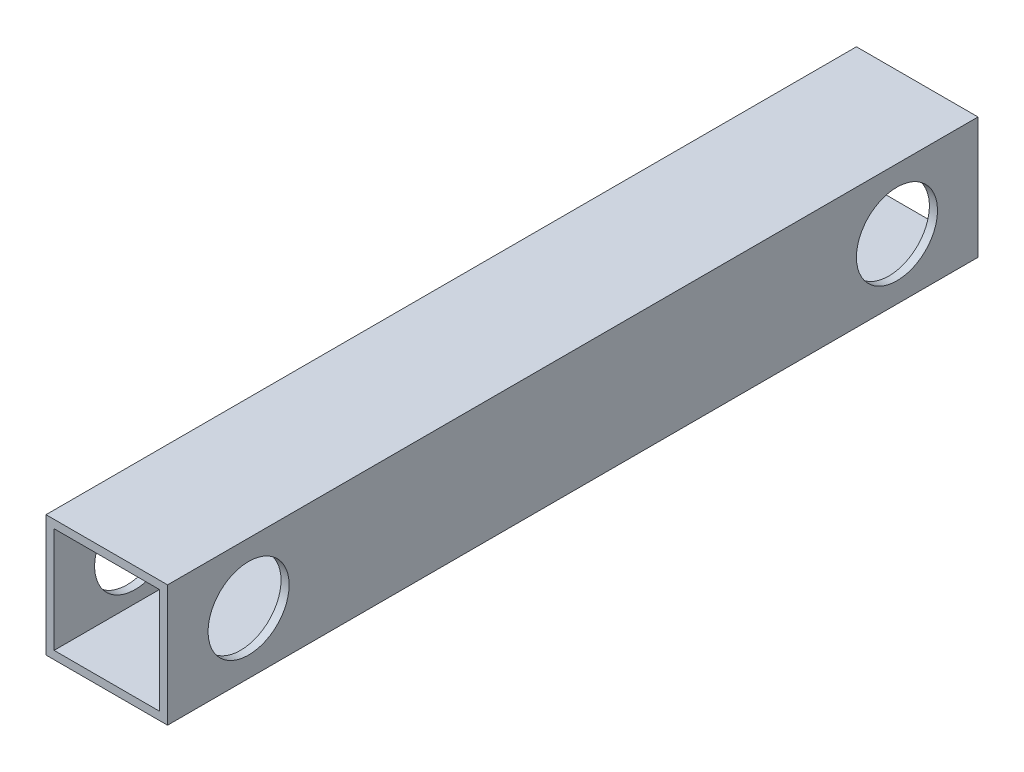
ISO-10303-21;
HEADER;
FILE_DESCRIPTION(('STEP AP214'),'2;1');
FILE_NAME('part.step','',(''),(''),'','','');
FILE_SCHEMA(('AUTOMOTIVE_DESIGN { 1 0 10303 214 1 1 1 1 }'));
ENDSEC;
DATA;
#1=APPLICATION_CONTEXT('core data for automotive mechanical design processes');
#2=APPLICATION_PROTOCOL_DEFINITION('international standard','automotive_design',2000,#1);
#3=PRODUCT_CONTEXT('',#1,'mechanical');
#4=PRODUCT('Part','Part','',(#3));
#5=PRODUCT_RELATED_PRODUCT_CATEGORY('part','',(#4));
#6=PRODUCT_DEFINITION_FORMATION('','',#4);
#7=PRODUCT_DEFINITION_CONTEXT('part definition',#1,'design');
#8=PRODUCT_DEFINITION('design','',#6,#7);
#9=PRODUCT_DEFINITION_SHAPE('','',#8);
#10=(LENGTH_UNIT() NAMED_UNIT(*) SI_UNIT(.MILLI.,.METRE.));
#11=(NAMED_UNIT(*) PLANE_ANGLE_UNIT() SI_UNIT($,.RADIAN.));
#12=(NAMED_UNIT(*) SI_UNIT($,.STERADIAN.) SOLID_ANGLE_UNIT());
#13=UNCERTAINTY_MEASURE_WITH_UNIT(LENGTH_MEASURE(1.E-05),#10,'distance_accuracy_value','');
#14=(GEOMETRIC_REPRESENTATION_CONTEXT(3) GLOBAL_UNCERTAINTY_ASSIGNED_CONTEXT((#13)) GLOBAL_UNIT_ASSIGNED_CONTEXT((#10,
#11,#12)) REPRESENTATION_CONTEXT('',''));
#15=CARTESIAN_POINT('',(0.,0.,0.));
#16=DIRECTION('',(0.,0.,1.));
#17=DIRECTION('',(1.,0.,0.));
#18=AXIS2_PLACEMENT_3D('',#15,#16,#17);
#19=CARTESIAN_POINT('',(0.,0.,200.));
#20=DIRECTION('',(0.,0.,-1.));
#21=DIRECTION('',(-1.,0.,0.));
#22=AXIS2_PLACEMENT_3D('',#19,#20,#21);
#23=PLANE('',#22);
#24=DIRECTION('',(0.,1.,0.));
#25=VECTOR('',#24,1.);
#26=CARTESIAN_POINT('',(15.,-15.,200.));
#27=LINE('',#26,#25);
#28=CARTESIAN_POINT('',(15.,-15.,200.));
#29=VERTEX_POINT('',#28);
#30=CARTESIAN_POINT('',(15.,15.,200.));
#31=VERTEX_POINT('',#30);
#32=EDGE_CURVE('E157',#29,#31,#27,.T.);
#33=ORIENTED_EDGE('',*,*,#32,.T.);
#34=DIRECTION('',(-1.,0.,0.));
#35=VECTOR('',#34,1.);
#36=CARTESIAN_POINT('',(-15.,15.,200.));
#37=LINE('',#36,#35);
#38=CARTESIAN_POINT('',(-15.,15.,200.));
#39=VERTEX_POINT('',#38);
#40=EDGE_CURVE('E161',#31,#39,#37,.T.);
#41=ORIENTED_EDGE('',*,*,#40,.T.);
#42=DIRECTION('',(0.,-1.,0.));
#43=VECTOR('',#42,1.);
#44=CARTESIAN_POINT('',(-15.,-15.,200.));
#45=LINE('',#44,#43);
#46=CARTESIAN_POINT('',(-15.,-15.,200.));
#47=VERTEX_POINT('',#46);
#48=EDGE_CURVE('E165',#39,#47,#45,.T.);
#49=ORIENTED_EDGE('',*,*,#48,.T.);
#50=DIRECTION('',(1.,0.,0.));
#51=VECTOR('',#50,1.);
#52=CARTESIAN_POINT('',(-15.,-15.,200.));
#53=LINE('',#52,#51);
#54=EDGE_CURVE('E168',#47,#29,#53,.T.);
#55=ORIENTED_EDGE('',*,*,#54,.T.);
#56=EDGE_LOOP('',(#33,#41,#49,#55));
#57=FACE_BOUND('',#56,.T.);
#58=DIRECTION('',(0.,1.,0.));
#59=VECTOR('',#58,1.);
#60=CARTESIAN_POINT('',(13.,-13.,200.));
#61=LINE('',#60,#59);
#62=CARTESIAN_POINT('',(13.,-13.,200.));
#63=VERTEX_POINT('',#62);
#64=CARTESIAN_POINT('',(13.,13.,200.));
#65=VERTEX_POINT('',#64);
#66=EDGE_CURVE('E107',#63,#65,#61,.T.);
#67=ORIENTED_EDGE('',*,*,#66,.F.);
#68=DIRECTION('',(1.,0.,0.));
#69=VECTOR('',#68,1.);
#70=CARTESIAN_POINT('',(-13.,-13.,200.));
#71=LINE('',#70,#69);
#72=CARTESIAN_POINT('',(-13.,-13.,200.));
#73=VERTEX_POINT('',#72);
#74=EDGE_CURVE('E133',#73,#63,#71,.T.);
#75=ORIENTED_EDGE('',*,*,#74,.F.);
#76=DIRECTION('',(0.,-1.,0.));
#77=VECTOR('',#76,1.);
#78=CARTESIAN_POINT('',(-13.,-13.,200.));
#79=LINE('',#78,#77);
#80=CARTESIAN_POINT('',(-13.,13.,200.));
#81=VERTEX_POINT('',#80);
#82=EDGE_CURVE('E129',#81,#73,#79,.T.);
#83=ORIENTED_EDGE('',*,*,#82,.F.);
#84=DIRECTION('',(-1.,0.,0.));
#85=VECTOR('',#84,1.);
#86=CARTESIAN_POINT('',(-13.,13.,200.));
#87=LINE('',#86,#85);
#88=EDGE_CURVE('E116',#65,#81,#87,.T.);
#89=ORIENTED_EDGE('',*,*,#88,.F.);
#90=EDGE_LOOP('',(#67,#75,#83,#89));
#91=FACE_BOUND('',#90,.T.);
#92=ADVANCED_FACE('F39',(#57,#91),#23,.F.);
#93=CARTESIAN_POINT('',(0.,0.,0.));
#94=DIRECTION('',(0.,0.,-1.));
#95=DIRECTION('',(-1.,0.,0.));
#96=AXIS2_PLACEMENT_3D('',#93,#94,#95);
#97=PLANE('',#96);
#98=DIRECTION('',(0.,1.,0.));
#99=VECTOR('',#98,1.);
#100=CARTESIAN_POINT('',(15.,-15.,0.));
#101=LINE('',#100,#99);
#102=CARTESIAN_POINT('',(15.,-15.,0.));
#103=VERTEX_POINT('',#102);
#104=CARTESIAN_POINT('',(15.,15.,0.));
#105=VERTEX_POINT('',#104);
#106=EDGE_CURVE('E125',#103,#105,#101,.T.);
#107=ORIENTED_EDGE('',*,*,#106,.F.);
#108=DIRECTION('',(1.,0.,0.));
#109=VECTOR('',#108,1.);
#110=CARTESIAN_POINT('',(-15.,-15.,0.));
#111=LINE('',#110,#109);
#112=CARTESIAN_POINT('',(-15.,-15.,0.));
#113=VERTEX_POINT('',#112);
#114=EDGE_CURVE('E162',#113,#103,#111,.T.);
#115=ORIENTED_EDGE('',*,*,#114,.F.);
#116=DIRECTION('',(0.,-1.,0.));
#117=VECTOR('',#116,1.);
#118=CARTESIAN_POINT('',(-15.,-15.,0.));
#119=LINE('',#118,#117);
#120=CARTESIAN_POINT('',(-15.,15.,0.));
#121=VERTEX_POINT('',#120);
#122=EDGE_CURVE('E178',#121,#113,#119,.T.);
#123=ORIENTED_EDGE('',*,*,#122,.F.);
#124=DIRECTION('',(-1.,0.,0.));
#125=VECTOR('',#124,1.);
#126=CARTESIAN_POINT('',(-15.,15.,0.));
#127=LINE('',#126,#125);
#128=EDGE_CURVE('E175',#105,#121,#127,.T.);
#129=ORIENTED_EDGE('',*,*,#128,.F.);
#130=EDGE_LOOP('',(#107,#115,#123,#129));
#131=FACE_BOUND('',#130,.T.);
#132=DIRECTION('',(1.,0.,0.));
#133=VECTOR('',#132,1.);
#134=CARTESIAN_POINT('',(-13.,-13.,0.));
#135=LINE('',#134,#133);
#136=CARTESIAN_POINT('',(-13.,-13.,0.));
#137=VERTEX_POINT('',#136);
#138=CARTESIAN_POINT('',(13.,-13.,0.));
#139=VERTEX_POINT('',#138);
#140=EDGE_CURVE('E117',#137,#139,#135,.T.);
#141=ORIENTED_EDGE('',*,*,#140,.T.);
#142=DIRECTION('',(0.,1.,0.));
#143=VECTOR('',#142,1.);
#144=CARTESIAN_POINT('',(13.,-13.,0.));
#145=LINE('',#144,#143);
#146=CARTESIAN_POINT('',(13.,13.,0.));
#147=VERTEX_POINT('',#146);
#148=EDGE_CURVE('E65',#139,#147,#145,.T.);
#149=ORIENTED_EDGE('',*,*,#148,.T.);
#150=DIRECTION('',(-1.,0.,0.));
#151=VECTOR('',#150,1.);
#152=CARTESIAN_POINT('',(-13.,13.,0.));
#153=LINE('',#152,#151);
#154=CARTESIAN_POINT('',(-13.,13.,0.));
#155=VERTEX_POINT('',#154);
#156=EDGE_CURVE('E123',#147,#155,#153,.T.);
#157=ORIENTED_EDGE('',*,*,#156,.T.);
#158=DIRECTION('',(0.,-1.,0.));
#159=VECTOR('',#158,1.);
#160=CARTESIAN_POINT('',(-13.,-13.,0.));
#161=LINE('',#160,#159);
#162=EDGE_CURVE('E144',#155,#137,#161,.T.);
#163=ORIENTED_EDGE('',*,*,#162,.T.);
#164=EDGE_LOOP('',(#141,#149,#157,#163));
#165=FACE_BOUND('',#164,.T.);
#166=ADVANCED_FACE('F244',(#131,#165),#97,.T.);
#167=CARTESIAN_POINT('',(15.,-15.,200.));
#168=DIRECTION('',(-1.,0.,0.));
#169=DIRECTION('',(0.,0.,1.));
#170=AXIS2_PLACEMENT_3D('',#167,#168,#169);
#171=PLANE('',#170);
#172=CARTESIAN_POINT('',(15.,0.,180.));
#173=DIRECTION('',(1.,0.,0.));
#174=DIRECTION('',(0.,0.,-1.));
#175=AXIS2_PLACEMENT_3D('',#172,#173,#174);
#176=CIRCLE('',#175,10.);
#177=CARTESIAN_POINT('',(15.,0.,170.));
#178=VERTEX_POINT('',#177);
#179=EDGE_CURVE('E196',#178,#178,#176,.T.);
#180=ORIENTED_EDGE('',*,*,#179,.F.);
#181=EDGE_LOOP('',(#180));
#182=FACE_BOUND('',#181,.T.);
#183=CARTESIAN_POINT('',(15.,0.,20.));
#184=DIRECTION('',(1.,0.,0.));
#185=DIRECTION('',(0.,0.,1.));
#186=AXIS2_PLACEMENT_3D('',#183,#184,#185);
#187=CIRCLE('',#186,10.);
#188=CARTESIAN_POINT('',(15.,0.,30.));
#189=VERTEX_POINT('',#188);
#190=EDGE_CURVE('E205',#189,#189,#187,.T.);
#191=ORIENTED_EDGE('',*,*,#190,.F.);
#192=EDGE_LOOP('',(#191));
#193=FACE_BOUND('',#192,.T.);
#194=ORIENTED_EDGE('',*,*,#106,.T.);
#195=DIRECTION('',(0.,0.,-1.));
#196=VECTOR('',#195,1.);
#197=CARTESIAN_POINT('',(15.,15.,200.));
#198=LINE('',#197,#196);
#199=EDGE_CURVE('E11',#31,#105,#198,.T.);
#200=ORIENTED_EDGE('',*,*,#199,.F.);
#201=ORIENTED_EDGE('',*,*,#32,.F.);
#202=DIRECTION('',(0.,0.,-1.));
#203=VECTOR('',#202,1.);
#204=CARTESIAN_POINT('',(15.,-15.,200.));
#205=LINE('',#204,#203);
#206=EDGE_CURVE('E171',#29,#103,#205,.T.);
#207=ORIENTED_EDGE('',*,*,#206,.T.);
#208=EDGE_LOOP('',(#194,#200,#201,#207));
#209=FACE_BOUND('',#208,.T.);
#210=ADVANCED_FACE('F41',(#182,#193,#209),#171,.F.);
#211=CARTESIAN_POINT('',(-15.,15.,200.));
#212=DIRECTION('',(0.,-1.,0.));
#213=DIRECTION('',(0.,0.,-1.));
#214=AXIS2_PLACEMENT_3D('',#211,#212,#213);
#215=PLANE('',#214);
#216=ORIENTED_EDGE('',*,*,#128,.T.);
#217=DIRECTION('',(0.,0.,-1.));
#218=VECTOR('',#217,1.);
#219=CARTESIAN_POINT('',(-15.,15.,200.));
#220=LINE('',#219,#218);
#221=EDGE_CURVE('E49',#39,#121,#220,.T.);
#222=ORIENTED_EDGE('',*,*,#221,.F.);
#223=ORIENTED_EDGE('',*,*,#40,.F.);
#224=ORIENTED_EDGE('',*,*,#199,.T.);
#225=EDGE_LOOP('',(#216,#222,#223,#224));
#226=FACE_BOUND('',#225,.T.);
#227=ADVANCED_FACE('F260',(#226),#215,.F.);
#228=CARTESIAN_POINT('',(-15.,-15.,200.));
#229=DIRECTION('',(1.,0.,0.));
#230=DIRECTION('',(0.,0.,-1.));
#231=AXIS2_PLACEMENT_3D('',#228,#229,#230);
#232=PLANE('',#231);
#233=CARTESIAN_POINT('',(-15.,0.,180.));
#234=DIRECTION('',(1.,0.,0.));
#235=DIRECTION('',(0.,0.,-1.));
#236=AXIS2_PLACEMENT_3D('',#233,#234,#235);
#237=CIRCLE('',#236,10.);
#238=CARTESIAN_POINT('',(-15.,0.,170.));
#239=VERTEX_POINT('',#238);
#240=EDGE_CURVE('E141',#239,#239,#237,.T.);
#241=ORIENTED_EDGE('',*,*,#240,.T.);
#242=EDGE_LOOP('',(#241));
#243=FACE_BOUND('',#242,.T.);
#244=CARTESIAN_POINT('',(-15.,0.,20.));
#245=DIRECTION('',(1.,0.,0.));
#246=DIRECTION('',(0.,0.,-1.));
#247=AXIS2_PLACEMENT_3D('',#244,#245,#246);
#248=CIRCLE('',#247,10.);
#249=CARTESIAN_POINT('',(-15.,0.,9.99999999999998));
#250=VERTEX_POINT('',#249);
#251=EDGE_CURVE('E202',#250,#250,#248,.T.);
#252=ORIENTED_EDGE('',*,*,#251,.T.);
#253=EDGE_LOOP('',(#252));
#254=FACE_BOUND('',#253,.T.);
#255=ORIENTED_EDGE('',*,*,#122,.T.);
#256=DIRECTION('',(0.,0.,-1.));
#257=VECTOR('',#256,1.);
#258=CARTESIAN_POINT('',(-15.,-15.,200.));
#259=LINE('',#258,#257);
#260=EDGE_CURVE('E186',#47,#113,#259,.T.);
#261=ORIENTED_EDGE('',*,*,#260,.F.);
#262=ORIENTED_EDGE('',*,*,#48,.F.);
#263=ORIENTED_EDGE('',*,*,#221,.T.);
#264=EDGE_LOOP('',(#255,#261,#262,#263));
#265=FACE_BOUND('',#264,.T.);
#266=ADVANCED_FACE('F223',(#243,#254,#265),#232,.F.);
#267=CARTESIAN_POINT('',(-15.,-15.,200.));
#268=DIRECTION('',(0.,1.,0.));
#269=DIRECTION('',(0.,0.,1.));
#270=AXIS2_PLACEMENT_3D('',#267,#268,#269);
#271=PLANE('',#270);
#272=ORIENTED_EDGE('',*,*,#114,.T.);
#273=ORIENTED_EDGE('',*,*,#206,.F.);
#274=ORIENTED_EDGE('',*,*,#54,.F.);
#275=ORIENTED_EDGE('',*,*,#260,.T.);
#276=EDGE_LOOP('',(#272,#273,#274,#275));
#277=FACE_BOUND('',#276,.T.);
#278=ADVANCED_FACE('F255',(#277),#271,.F.);
#279=CARTESIAN_POINT('',(13.,-13.,200.));
#280=DIRECTION('',(-1.,0.,0.));
#281=DIRECTION('',(0.,0.,1.));
#282=AXIS2_PLACEMENT_3D('',#279,#280,#281);
#283=PLANE('',#282);
#284=CARTESIAN_POINT('',(13.,0.,180.));
#285=DIRECTION('',(-1.,0.,0.));
#286=DIRECTION('',(0.,0.,1.));
#287=AXIS2_PLACEMENT_3D('',#284,#285,#286);
#288=CIRCLE('',#287,10.);
#289=CARTESIAN_POINT('',(13.,0.,190.));
#290=VERTEX_POINT('',#289);
#291=EDGE_CURVE('E216',#290,#290,#288,.T.);
#292=ORIENTED_EDGE('',*,*,#291,.F.);
#293=EDGE_LOOP('',(#292));
#294=FACE_BOUND('',#293,.T.);
#295=CARTESIAN_POINT('',(13.,0.,20.));
#296=DIRECTION('',(-1.,0.,0.));
#297=DIRECTION('',(0.,0.,1.));
#298=AXIS2_PLACEMENT_3D('',#295,#296,#297);
#299=CIRCLE('',#298,10.);
#300=CARTESIAN_POINT('',(13.,0.,30.));
#301=VERTEX_POINT('',#300);
#302=EDGE_CURVE('E195',#301,#301,#299,.T.);
#303=ORIENTED_EDGE('',*,*,#302,.F.);
#304=EDGE_LOOP('',(#303));
#305=FACE_BOUND('',#304,.T.);
#306=ORIENTED_EDGE('',*,*,#148,.F.);
#307=DIRECTION('',(0.,0.,-1.));
#308=VECTOR('',#307,1.);
#309=CARTESIAN_POINT('',(13.,-13.,200.));
#310=LINE('',#309,#308);
#311=EDGE_CURVE('E111',#63,#139,#310,.T.);
#312=ORIENTED_EDGE('',*,*,#311,.F.);
#313=ORIENTED_EDGE('',*,*,#66,.T.);
#314=DIRECTION('',(0.,0.,-1.));
#315=VECTOR('',#314,1.);
#316=CARTESIAN_POINT('',(13.,13.,200.));
#317=LINE('',#316,#315);
#318=EDGE_CURVE('E110',#65,#147,#317,.T.);
#319=ORIENTED_EDGE('',*,*,#318,.T.);
#320=EDGE_LOOP('',(#306,#312,#313,#319));
#321=FACE_BOUND('',#320,.T.);
#322=ADVANCED_FACE('F109',(#294,#305,#321),#283,.T.);
#323=CARTESIAN_POINT('',(-13.,13.,200.));
#324=DIRECTION('',(0.,-1.,0.));
#325=DIRECTION('',(0.,0.,-1.));
#326=AXIS2_PLACEMENT_3D('',#323,#324,#325);
#327=PLANE('',#326);
#328=ORIENTED_EDGE('',*,*,#156,.F.);
#329=ORIENTED_EDGE('',*,*,#318,.F.);
#330=ORIENTED_EDGE('',*,*,#88,.T.);
#331=DIRECTION('',(0.,0.,-1.));
#332=VECTOR('',#331,1.);
#333=CARTESIAN_POINT('',(-13.,13.,200.));
#334=LINE('',#333,#332);
#335=EDGE_CURVE('E126',#81,#155,#334,.T.);
#336=ORIENTED_EDGE('',*,*,#335,.T.);
#337=EDGE_LOOP('',(#328,#329,#330,#336));
#338=FACE_BOUND('',#337,.T.);
#339=ADVANCED_FACE('F120',(#338),#327,.T.);
#340=CARTESIAN_POINT('',(-13.,-13.,200.));
#341=DIRECTION('',(1.,0.,0.));
#342=DIRECTION('',(0.,0.,-1.));
#343=AXIS2_PLACEMENT_3D('',#340,#341,#342);
#344=PLANE('',#343);
#345=CARTESIAN_POINT('',(-13.,0.,180.));
#346=DIRECTION('',(1.,0.,0.));
#347=DIRECTION('',(0.,0.,-1.));
#348=AXIS2_PLACEMENT_3D('',#345,#346,#347);
#349=CIRCLE('',#348,10.);
#350=CARTESIAN_POINT('',(-13.,0.,170.));
#351=VERTEX_POINT('',#350);
#352=EDGE_CURVE('E43',#351,#351,#349,.T.);
#353=ORIENTED_EDGE('',*,*,#352,.F.);
#354=EDGE_LOOP('',(#353));
#355=FACE_BOUND('',#354,.T.);
#356=CARTESIAN_POINT('',(-13.,0.,20.));
#357=DIRECTION('',(1.,0.,0.));
#358=DIRECTION('',(0.,0.,-1.));
#359=AXIS2_PLACEMENT_3D('',#356,#357,#358);
#360=CIRCLE('',#359,10.);
#361=CARTESIAN_POINT('',(-13.,0.,9.99999999999998));
#362=VERTEX_POINT('',#361);
#363=EDGE_CURVE('E192',#362,#362,#360,.T.);
#364=ORIENTED_EDGE('',*,*,#363,.F.);
#365=EDGE_LOOP('',(#364));
#366=FACE_BOUND('',#365,.T.);
#367=ORIENTED_EDGE('',*,*,#162,.F.);
#368=ORIENTED_EDGE('',*,*,#335,.F.);
#369=ORIENTED_EDGE('',*,*,#82,.T.);
#370=DIRECTION('',(0.,0.,-1.));
#371=VECTOR('',#370,1.);
#372=CARTESIAN_POINT('',(-13.,-13.,200.));
#373=LINE('',#372,#371);
#374=EDGE_CURVE('E57',#73,#137,#373,.T.);
#375=ORIENTED_EDGE('',*,*,#374,.T.);
#376=EDGE_LOOP('',(#367,#368,#369,#375));
#377=FACE_BOUND('',#376,.T.);
#378=ADVANCED_FACE('F282',(#355,#366,#377),#344,.T.);
#379=CARTESIAN_POINT('',(-13.,-13.,200.));
#380=DIRECTION('',(0.,1.,0.));
#381=DIRECTION('',(0.,0.,1.));
#382=AXIS2_PLACEMENT_3D('',#379,#380,#381);
#383=PLANE('',#382);
#384=ORIENTED_EDGE('',*,*,#140,.F.);
#385=ORIENTED_EDGE('',*,*,#374,.F.);
#386=ORIENTED_EDGE('',*,*,#74,.T.);
#387=ORIENTED_EDGE('',*,*,#311,.T.);
#388=EDGE_LOOP('',(#384,#385,#386,#387));
#389=FACE_BOUND('',#388,.T.);
#390=ADVANCED_FACE('F239',(#389),#383,.T.);
#391=CARTESIAN_POINT('',(-185.,0.,20.));
#392=DIRECTION('',(1.,0.,0.));
#393=DIRECTION('',(0.,0.,-1.));
#394=AXIS2_PLACEMENT_3D('',#391,#392,#393);
#395=CYLINDRICAL_SURFACE('',#394,10.);
#396=ORIENTED_EDGE('',*,*,#363,.T.);
#397=EDGE_LOOP('',(#396));
#398=FACE_BOUND('',#397,.T.);
#399=ORIENTED_EDGE('',*,*,#251,.F.);
#400=EDGE_LOOP('',(#399));
#401=FACE_BOUND('',#400,.T.);
#402=ADVANCED_FACE('F229',(#398,#401),#395,.F.);
#403=CARTESIAN_POINT('',(-185.,0.,180.));
#404=DIRECTION('',(1.,0.,0.));
#405=DIRECTION('',(0.,0.,-1.));
#406=AXIS2_PLACEMENT_3D('',#403,#404,#405);
#407=CYLINDRICAL_SURFACE('',#406,10.);
#408=ORIENTED_EDGE('',*,*,#352,.T.);
#409=EDGE_LOOP('',(#408));
#410=FACE_BOUND('',#409,.T.);
#411=ORIENTED_EDGE('',*,*,#240,.F.);
#412=EDGE_LOOP('',(#411));
#413=FACE_BOUND('',#412,.T.);
#414=ADVANCED_FACE('F226',(#410,#413),#407,.F.);
#415=ORIENTED_EDGE('',*,*,#302,.T.);
#416=EDGE_LOOP('',(#415));
#417=FACE_BOUND('',#416,.T.);
#418=ORIENTED_EDGE('',*,*,#190,.T.);
#419=EDGE_LOOP('',(#418));
#420=FACE_BOUND('',#419,.T.);
#421=ADVANCED_FACE('F228',(#417,#420),#395,.F.);
#422=ORIENTED_EDGE('',*,*,#291,.T.);
#423=EDGE_LOOP('',(#422));
#424=FACE_BOUND('',#423,.T.);
#425=ORIENTED_EDGE('',*,*,#179,.T.);
#426=EDGE_LOOP('',(#425));
#427=FACE_BOUND('',#426,.T.);
#428=ADVANCED_FACE('F232',(#424,#427),#407,.F.);
#429=CLOSED_SHELL('',(#92,#166,#210,#227,#266,#278,#322,#339,#378,#390,#402,#414,#421,#428));
#430=MANIFOLD_SOLID_BREP('B2',#429);
#431=ADVANCED_BREP_SHAPE_REPRESENTATION('',(#18,#430),#14);
#432=SHAPE_DEFINITION_REPRESENTATION(#9,#431);
ENDSEC;
END-ISO-10303-21;
